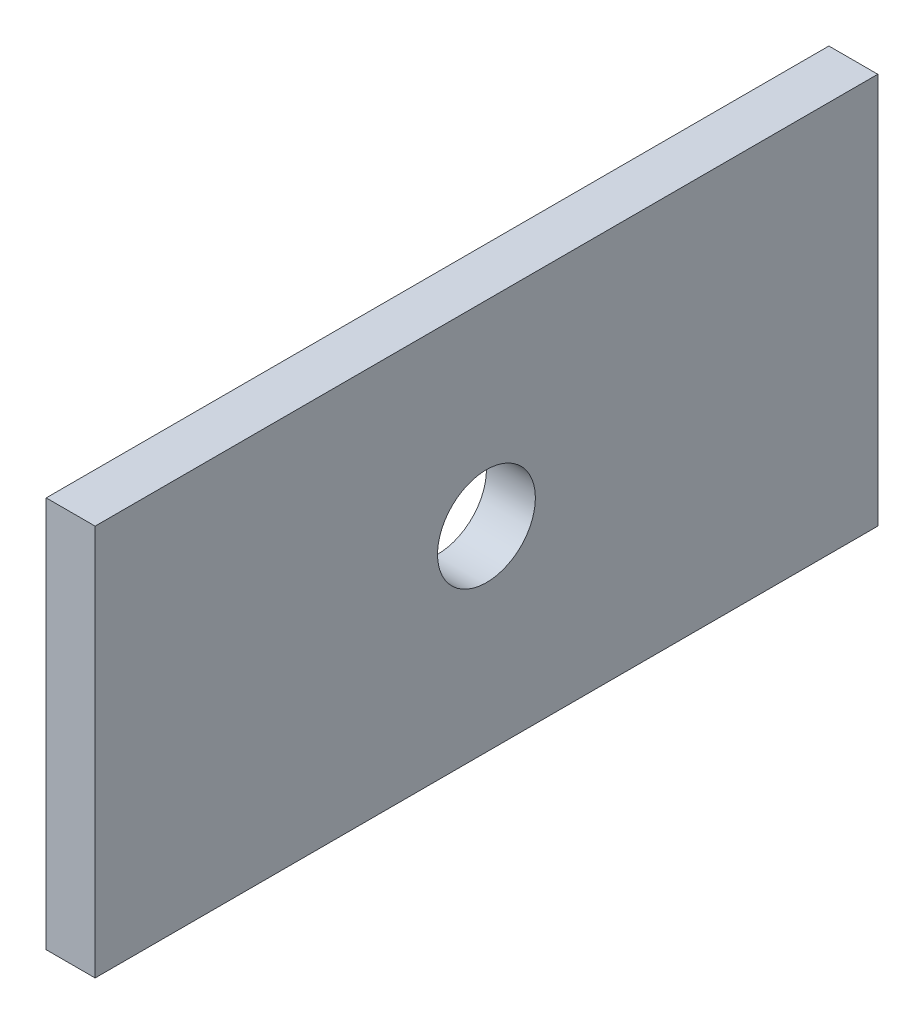
ISO-10303-21;
HEADER;
FILE_DESCRIPTION(('STEP AP214'),'2;1');
FILE_NAME('part.step','',(''),(''),'','','');
FILE_SCHEMA(('AUTOMOTIVE_DESIGN { 1 0 10303 214 1 1 1 1 }'));
ENDSEC;
DATA;
#1=APPLICATION_CONTEXT('core data for automotive mechanical design processes');
#2=APPLICATION_PROTOCOL_DEFINITION('international standard','automotive_design',2000,#1);
#3=PRODUCT_CONTEXT('',#1,'mechanical');
#4=PRODUCT('Part','Part','',(#3));
#5=PRODUCT_RELATED_PRODUCT_CATEGORY('part','',(#4));
#6=PRODUCT_DEFINITION_FORMATION('','',#4);
#7=PRODUCT_DEFINITION_CONTEXT('part definition',#1,'design');
#8=PRODUCT_DEFINITION('design','',#6,#7);
#9=PRODUCT_DEFINITION_SHAPE('','',#8);
#10=(LENGTH_UNIT() NAMED_UNIT(*) SI_UNIT(.MILLI.,.METRE.));
#11=(NAMED_UNIT(*) PLANE_ANGLE_UNIT() SI_UNIT($,.RADIAN.));
#12=(NAMED_UNIT(*) SI_UNIT($,.STERADIAN.) SOLID_ANGLE_UNIT());
#13=UNCERTAINTY_MEASURE_WITH_UNIT(LENGTH_MEASURE(1.E-05),#10,'distance_accuracy_value','');
#14=(GEOMETRIC_REPRESENTATION_CONTEXT(3) GLOBAL_UNCERTAINTY_ASSIGNED_CONTEXT((#13)) GLOBAL_UNIT_ASSIGNED_CONTEXT((#10,
#11,#12)) REPRESENTATION_CONTEXT('',''));
#15=CARTESIAN_POINT('',(0.,0.,0.));
#16=DIRECTION('',(0.,0.,1.));
#17=DIRECTION('',(1.,0.,0.));
#18=AXIS2_PLACEMENT_3D('',#15,#16,#17);
#19=CARTESIAN_POINT('',(3.175,12.7,-25.4));
#20=DIRECTION('',(0.,0.,1.));
#21=DIRECTION('',(0.,-1.,0.));
#22=AXIS2_PLACEMENT_3D('',#19,#20,#21);
#23=PLANE('',#22);
#24=DIRECTION('',(0.,1.,0.));
#25=VECTOR('',#24,1.);
#26=CARTESIAN_POINT('',(0.,12.7,-25.4));
#27=LINE('',#26,#25);
#28=CARTESIAN_POINT('',(0.,-12.7,-25.4));
#29=VERTEX_POINT('',#28);
#30=CARTESIAN_POINT('',(0.,12.7,-25.4));
#31=VERTEX_POINT('',#30);
#32=EDGE_CURVE('E96',#29,#31,#27,.T.);
#33=ORIENTED_EDGE('',*,*,#32,.T.);
#34=DIRECTION('',(-1.,0.,0.));
#35=VECTOR('',#34,1.);
#36=CARTESIAN_POINT('',(3.175,12.7,-25.4));
#37=LINE('',#36,#35);
#38=CARTESIAN_POINT('',(3.175,12.7,-25.4));
#39=VERTEX_POINT('',#38);
#40=EDGE_CURVE('E11',#39,#31,#37,.T.);
#41=ORIENTED_EDGE('',*,*,#40,.F.);
#42=DIRECTION('',(0.,1.,0.));
#43=VECTOR('',#42,1.);
#44=CARTESIAN_POINT('',(3.175,12.7,-25.4));
#45=LINE('',#44,#43);
#46=CARTESIAN_POINT('',(3.175,-12.7,-25.4));
#47=VERTEX_POINT('',#46);
#48=EDGE_CURVE('E84',#47,#39,#45,.T.);
#49=ORIENTED_EDGE('',*,*,#48,.F.);
#50=DIRECTION('',(-1.,0.,0.));
#51=VECTOR('',#50,1.);
#52=CARTESIAN_POINT('',(3.175,-12.7,-25.4));
#53=LINE('',#52,#51);
#54=EDGE_CURVE('E92',#47,#29,#53,.T.);
#55=ORIENTED_EDGE('',*,*,#54,.T.);
#56=EDGE_LOOP('',(#33,#41,#49,#55));
#57=FACE_BOUND('',#56,.T.);
#58=ADVANCED_FACE('F33',(#57),#23,.F.);
#59=CARTESIAN_POINT('',(3.175,12.7,25.4));
#60=DIRECTION('',(0.,-1.,0.));
#61=DIRECTION('',(0.,0.,-1.));
#62=AXIS2_PLACEMENT_3D('',#59,#60,#61);
#63=PLANE('',#62);
#64=DIRECTION('',(0.,0.,1.));
#65=VECTOR('',#64,1.);
#66=CARTESIAN_POINT('',(0.,12.7,25.4));
#67=LINE('',#66,#65);
#68=CARTESIAN_POINT('',(0.,12.7,25.4));
#69=VERTEX_POINT('',#68);
#70=EDGE_CURVE('E88',#31,#69,#67,.T.);
#71=ORIENTED_EDGE('',*,*,#70,.T.);
#72=DIRECTION('',(-1.,0.,0.));
#73=VECTOR('',#72,1.);
#74=CARTESIAN_POINT('',(3.175,12.7,25.4));
#75=LINE('',#74,#73);
#76=CARTESIAN_POINT('',(3.175,12.7,25.4));
#77=VERTEX_POINT('',#76);
#78=EDGE_CURVE('E41',#77,#69,#75,.T.);
#79=ORIENTED_EDGE('',*,*,#78,.F.);
#80=DIRECTION('',(0.,0.,1.));
#81=VECTOR('',#80,1.);
#82=CARTESIAN_POINT('',(3.175,12.7,25.4));
#83=LINE('',#82,#81);
#84=EDGE_CURVE('E79',#39,#77,#83,.T.);
#85=ORIENTED_EDGE('',*,*,#84,.F.);
#86=ORIENTED_EDGE('',*,*,#40,.T.);
#87=EDGE_LOOP('',(#71,#79,#85,#86));
#88=FACE_BOUND('',#87,.T.);
#89=ADVANCED_FACE('F87',(#88),#63,.F.);
#90=CARTESIAN_POINT('',(3.175,12.7,25.4));
#91=DIRECTION('',(0.,0.,-1.));
#92=DIRECTION('',(0.,1.,0.));
#93=AXIS2_PLACEMENT_3D('',#90,#91,#92);
#94=PLANE('',#93);
#95=DIRECTION('',(0.,-1.,0.));
#96=VECTOR('',#95,1.);
#97=CARTESIAN_POINT('',(0.,12.7,25.4));
#98=LINE('',#97,#96);
#99=CARTESIAN_POINT('',(0.,-12.7,25.4));
#100=VERTEX_POINT('',#99);
#101=EDGE_CURVE('E66',#69,#100,#98,.T.);
#102=ORIENTED_EDGE('',*,*,#101,.T.);
#103=DIRECTION('',(-1.,0.,0.));
#104=VECTOR('',#103,1.);
#105=CARTESIAN_POINT('',(3.175,-12.7,25.4));
#106=LINE('',#105,#104);
#107=CARTESIAN_POINT('',(3.175,-12.7,25.4));
#108=VERTEX_POINT('',#107);
#109=EDGE_CURVE('E89',#108,#100,#106,.T.);
#110=ORIENTED_EDGE('',*,*,#109,.F.);
#111=DIRECTION('',(0.,-1.,0.));
#112=VECTOR('',#111,1.);
#113=CARTESIAN_POINT('',(3.175,12.7,25.4));
#114=LINE('',#113,#112);
#115=EDGE_CURVE('E82',#77,#108,#114,.T.);
#116=ORIENTED_EDGE('',*,*,#115,.F.);
#117=ORIENTED_EDGE('',*,*,#78,.T.);
#118=EDGE_LOOP('',(#102,#110,#116,#117));
#119=FACE_BOUND('',#118,.T.);
#120=ADVANCED_FACE('F90',(#119),#94,.F.);
#121=CARTESIAN_POINT('',(3.175,-12.7,25.4));
#122=DIRECTION('',(0.,1.,0.));
#123=DIRECTION('',(0.,0.,1.));
#124=AXIS2_PLACEMENT_3D('',#121,#122,#123);
#125=PLANE('',#124);
#126=DIRECTION('',(0.,0.,-1.));
#127=VECTOR('',#126,1.);
#128=CARTESIAN_POINT('',(0.,-12.7,25.4));
#129=LINE('',#128,#127);
#130=EDGE_CURVE('E72',#100,#29,#129,.T.);
#131=ORIENTED_EDGE('',*,*,#130,.T.);
#132=ORIENTED_EDGE('',*,*,#54,.F.);
#133=DIRECTION('',(0.,0.,-1.));
#134=VECTOR('',#133,1.);
#135=CARTESIAN_POINT('',(3.175,-12.7,25.4));
#136=LINE('',#135,#134);
#137=EDGE_CURVE('E49',#108,#47,#136,.T.);
#138=ORIENTED_EDGE('',*,*,#137,.F.);
#139=ORIENTED_EDGE('',*,*,#109,.T.);
#140=EDGE_LOOP('',(#131,#132,#138,#139));
#141=FACE_BOUND('',#140,.T.);
#142=ADVANCED_FACE('F104',(#141),#125,.F.);
#143=CARTESIAN_POINT('',(3.175,0.,0.));
#144=DIRECTION('',(1.,0.,0.));
#145=DIRECTION('',(0.,0.,-1.));
#146=AXIS2_PLACEMENT_3D('',#143,#144,#145);
#147=PLANE('',#146);
#148=CARTESIAN_POINT('',(3.175,0.,0.));
#149=DIRECTION('',(1.,0.,0.));
#150=DIRECTION('',(0.,0.,-1.));
#151=AXIS2_PLACEMENT_3D('',#148,#149,#150);
#152=CIRCLE('',#151,3.175);
#153=CARTESIAN_POINT('',(3.175,0.,-3.175));
#154=VERTEX_POINT('',#153);
#155=EDGE_CURVE('E110',#154,#154,#152,.T.);
#156=ORIENTED_EDGE('',*,*,#155,.F.);
#157=EDGE_LOOP('',(#156));
#158=FACE_BOUND('',#157,.T.);
#159=ORIENTED_EDGE('',*,*,#48,.T.);
#160=ORIENTED_EDGE('',*,*,#84,.T.);
#161=ORIENTED_EDGE('',*,*,#115,.T.);
#162=ORIENTED_EDGE('',*,*,#137,.T.);
#163=EDGE_LOOP('',(#159,#160,#161,#162));
#164=FACE_BOUND('',#163,.T.);
#165=ADVANCED_FACE('F80',(#158,#164),#147,.T.);
#166=CARTESIAN_POINT('',(0.,0.,0.));
#167=DIRECTION('',(1.,0.,0.));
#168=DIRECTION('',(0.,0.,-1.));
#169=AXIS2_PLACEMENT_3D('',#166,#167,#168);
#170=PLANE('',#169);
#171=CARTESIAN_POINT('',(0.,0.,0.));
#172=DIRECTION('',(1.,0.,0.));
#173=DIRECTION('',(0.,0.,-1.));
#174=AXIS2_PLACEMENT_3D('',#171,#172,#173);
#175=CIRCLE('',#174,3.175);
#176=CARTESIAN_POINT('',(0.,0.,-3.175));
#177=VERTEX_POINT('',#176);
#178=EDGE_CURVE('E99',#177,#177,#175,.T.);
#179=ORIENTED_EDGE('',*,*,#178,.T.);
#180=EDGE_LOOP('',(#179));
#181=FACE_BOUND('',#180,.T.);
#182=ORIENTED_EDGE('',*,*,#32,.F.);
#183=ORIENTED_EDGE('',*,*,#130,.F.);
#184=ORIENTED_EDGE('',*,*,#101,.F.);
#185=ORIENTED_EDGE('',*,*,#70,.F.);
#186=EDGE_LOOP('',(#182,#183,#184,#185));
#187=FACE_BOUND('',#186,.T.);
#188=ADVANCED_FACE('F107',(#181,#187),#170,.F.);
#189=CARTESIAN_POINT('',(0.,0.,0.));
#190=DIRECTION('',(1.,0.,0.));
#191=DIRECTION('',(0.,0.,-1.));
#192=AXIS2_PLACEMENT_3D('',#189,#190,#191);
#193=CYLINDRICAL_SURFACE('',#192,3.175);
#194=ORIENTED_EDGE('',*,*,#178,.F.);
#195=EDGE_LOOP('',(#194));
#196=FACE_BOUND('',#195,.T.);
#197=ORIENTED_EDGE('',*,*,#155,.T.);
#198=EDGE_LOOP('',(#197));
#199=FACE_BOUND('',#198,.T.);
#200=ADVANCED_FACE('F117',(#196,#199),#193,.F.);
#201=CLOSED_SHELL('',(#58,#89,#120,#142,#165,#188,#200));
#202=MANIFOLD_SOLID_BREP('B2',#201);
#203=ADVANCED_BREP_SHAPE_REPRESENTATION('',(#18,#202),#14);
#204=SHAPE_DEFINITION_REPRESENTATION(#9,#203);
ENDSEC;
END-ISO-10303-21;
